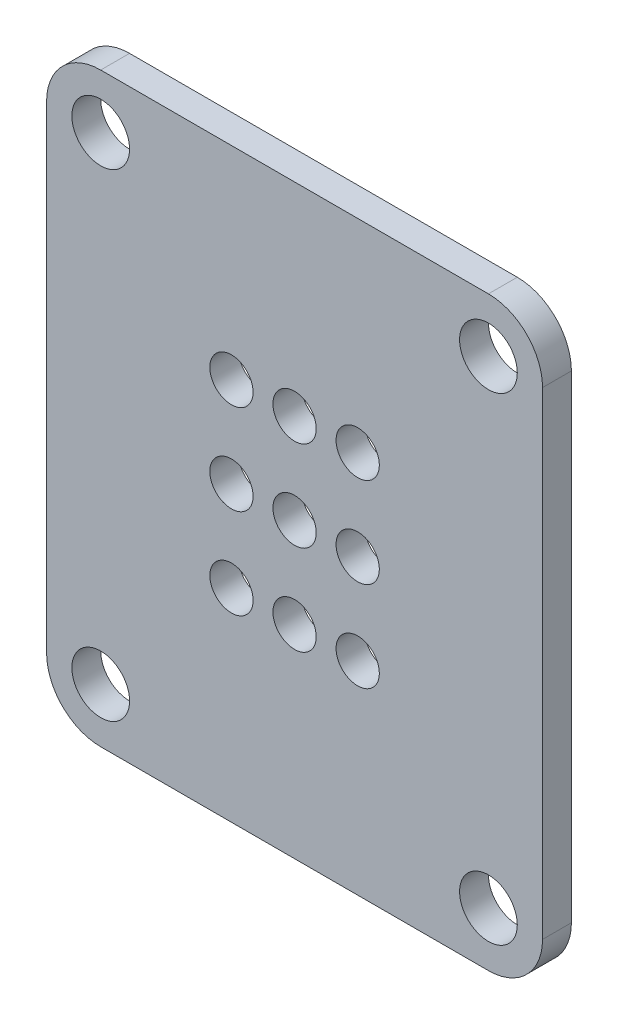
ISO-10303-21;
HEADER;
FILE_DESCRIPTION(('STEP AP214'),'2;1');
FILE_NAME('part.step','',(''),(''),'','','');
FILE_SCHEMA(('AUTOMOTIVE_DESIGN { 1 0 10303 214 1 1 1 1 }'));
ENDSEC;
DATA;
#1=APPLICATION_CONTEXT('core data for automotive mechanical design processes');
#2=APPLICATION_PROTOCOL_DEFINITION('international standard','automotive_design',2000,#1);
#3=PRODUCT_CONTEXT('',#1,'mechanical');
#4=PRODUCT('Part','Part','',(#3));
#5=PRODUCT_RELATED_PRODUCT_CATEGORY('part','',(#4));
#6=PRODUCT_DEFINITION_FORMATION('','',#4);
#7=PRODUCT_DEFINITION_CONTEXT('part definition',#1,'design');
#8=PRODUCT_DEFINITION('design','',#6,#7);
#9=PRODUCT_DEFINITION_SHAPE('','',#8);
#10=(LENGTH_UNIT() NAMED_UNIT(*) SI_UNIT(.MILLI.,.METRE.));
#11=(NAMED_UNIT(*) PLANE_ANGLE_UNIT() SI_UNIT($,.RADIAN.));
#12=(NAMED_UNIT(*) SI_UNIT($,.STERADIAN.) SOLID_ANGLE_UNIT());
#13=UNCERTAINTY_MEASURE_WITH_UNIT(LENGTH_MEASURE(1.E-05),#10,'distance_accuracy_value','');
#14=(GEOMETRIC_REPRESENTATION_CONTEXT(3) GLOBAL_UNCERTAINTY_ASSIGNED_CONTEXT((#13)) GLOBAL_UNIT_ASSIGNED_CONTEXT((#10,
#11,#12)) REPRESENTATION_CONTEXT('',''));
#15=CARTESIAN_POINT('',(0.,0.,0.));
#16=DIRECTION('',(0.,0.,1.));
#17=DIRECTION('',(1.,0.,0.));
#18=AXIS2_PLACEMENT_3D('',#15,#16,#17);
#19=CARTESIAN_POINT('',(-10.75,13.25,0.8));
#20=DIRECTION('',(0.,0.,-1.));
#21=DIRECTION('',(-1.,0.,0.));
#22=AXIS2_PLACEMENT_3D('',#19,#20,#21);
#23=CYLINDRICAL_SURFACE('',#22,3.00000000000001);
#24=CARTESIAN_POINT('',(-10.75,13.25,-0.8));
#25=DIRECTION('',(0.,0.,1.));
#26=DIRECTION('',(1.,0.,0.));
#27=AXIS2_PLACEMENT_3D('',#24,#25,#26);
#28=CIRCLE('',#27,3.00000000000001);
#29=CARTESIAN_POINT('',(-10.75,16.25,-0.8));
#30=VERTEX_POINT('',#29);
#31=CARTESIAN_POINT('',(-13.75,13.25,-0.8));
#32=VERTEX_POINT('',#31);
#33=EDGE_CURVE('E159',#30,#32,#28,.T.);
#34=ORIENTED_EDGE('',*,*,#33,.T.);
#35=DIRECTION('',(0.,0.,-1.));
#36=VECTOR('',#35,1.);
#37=CARTESIAN_POINT('',(-13.75,13.25,0.8));
#38=LINE('',#37,#36);
#39=CARTESIAN_POINT('',(-13.75,13.25,0.8));
#40=VERTEX_POINT('',#39);
#41=EDGE_CURVE('E70',#40,#32,#38,.T.);
#42=ORIENTED_EDGE('',*,*,#41,.F.);
#43=CARTESIAN_POINT('',(-10.75,13.25,0.8));
#44=DIRECTION('',(0.,0.,1.));
#45=DIRECTION('',(1.,0.,0.));
#46=AXIS2_PLACEMENT_3D('',#43,#44,#45);
#47=CIRCLE('',#46,3.00000000000001);
#48=CARTESIAN_POINT('',(-10.75,16.25,0.8));
#49=VERTEX_POINT('',#48);
#50=EDGE_CURVE('E206',#49,#40,#47,.T.);
#51=ORIENTED_EDGE('',*,*,#50,.F.);
#52=DIRECTION('',(0.,0.,-1.));
#53=VECTOR('',#52,1.);
#54=CARTESIAN_POINT('',(-10.75,16.25,0.8));
#55=LINE('',#54,#53);
#56=EDGE_CURVE('E12',#49,#30,#55,.T.);
#57=ORIENTED_EDGE('',*,*,#56,.T.);
#58=EDGE_LOOP('',(#34,#42,#51,#57));
#59=FACE_BOUND('',#58,.T.);
#60=ADVANCED_FACE('F61',(#59),#23,.T.);
#61=CARTESIAN_POINT('',(-13.75,0.,0.8));
#62=DIRECTION('',(1.,0.,0.));
#63=DIRECTION('',(0.,1.,0.));
#64=AXIS2_PLACEMENT_3D('',#61,#62,#63);
#65=PLANE('',#64);
#66=DIRECTION('',(0.,-1.,0.));
#67=VECTOR('',#66,1.);
#68=CARTESIAN_POINT('',(-13.75,0.,-0.8));
#69=LINE('',#68,#67);
#70=CARTESIAN_POINT('',(-13.75,-13.25,-0.8));
#71=VERTEX_POINT('',#70);
#72=EDGE_CURVE('E162',#32,#71,#69,.T.);
#73=ORIENTED_EDGE('',*,*,#72,.T.);
#74=DIRECTION('',(0.,0.,-1.));
#75=VECTOR('',#74,1.);
#76=CARTESIAN_POINT('',(-13.75,-13.25,0.8));
#77=LINE('',#76,#75);
#78=CARTESIAN_POINT('',(-13.75,-13.25,0.8));
#79=VERTEX_POINT('',#78);
#80=EDGE_CURVE('E180',#79,#71,#77,.T.);
#81=ORIENTED_EDGE('',*,*,#80,.F.);
#82=DIRECTION('',(0.,-1.,0.));
#83=VECTOR('',#82,1.);
#84=CARTESIAN_POINT('',(-13.75,0.,0.8));
#85=LINE('',#84,#83);
#86=EDGE_CURVE('E189',#40,#79,#85,.T.);
#87=ORIENTED_EDGE('',*,*,#86,.F.);
#88=ORIENTED_EDGE('',*,*,#41,.T.);
#89=EDGE_LOOP('',(#73,#81,#87,#88));
#90=FACE_BOUND('',#89,.T.);
#91=ADVANCED_FACE('F187',(#90),#65,.F.);
#92=CARTESIAN_POINT('',(-10.75,-13.25,0.8));
#93=DIRECTION('',(0.,0.,-1.));
#94=DIRECTION('',(-1.,0.,0.));
#95=AXIS2_PLACEMENT_3D('',#92,#93,#94);
#96=CYLINDRICAL_SURFACE('',#95,3.);
#97=CARTESIAN_POINT('',(-10.75,-13.25,-0.8));
#98=DIRECTION('',(0.,0.,1.));
#99=DIRECTION('',(1.,0.,0.));
#100=AXIS2_PLACEMENT_3D('',#97,#98,#99);
#101=CIRCLE('',#100,3.);
#102=CARTESIAN_POINT('',(-10.75,-16.25,-0.8));
#103=VERTEX_POINT('',#102);
#104=EDGE_CURVE('E164',#71,#103,#101,.T.);
#105=ORIENTED_EDGE('',*,*,#104,.T.);
#106=DIRECTION('',(0.,0.,-1.));
#107=VECTOR('',#106,1.);
#108=CARTESIAN_POINT('',(-10.75,-16.25,0.8));
#109=LINE('',#108,#107);
#110=CARTESIAN_POINT('',(-10.75,-16.25,0.8));
#111=VERTEX_POINT('',#110);
#112=EDGE_CURVE('E177',#111,#103,#109,.T.);
#113=ORIENTED_EDGE('',*,*,#112,.F.);
#114=CARTESIAN_POINT('',(-10.75,-13.25,0.8));
#115=DIRECTION('',(0.,0.,1.));
#116=DIRECTION('',(1.,0.,0.));
#117=AXIS2_PLACEMENT_3D('',#114,#115,#116);
#118=CIRCLE('',#117,3.);
#119=EDGE_CURVE('E202',#79,#111,#118,.T.);
#120=ORIENTED_EDGE('',*,*,#119,.F.);
#121=ORIENTED_EDGE('',*,*,#80,.T.);
#122=EDGE_LOOP('',(#105,#113,#120,#121));
#123=FACE_BOUND('',#122,.T.);
#124=ADVANCED_FACE('F198',(#123),#96,.T.);
#125=CARTESIAN_POINT('',(0.,-16.25,0.8));
#126=DIRECTION('',(0.,1.,0.));
#127=DIRECTION('',(0.,0.,1.));
#128=AXIS2_PLACEMENT_3D('',#125,#126,#127);
#129=PLANE('',#128);
#130=DIRECTION('',(1.,0.,0.));
#131=VECTOR('',#130,1.);
#132=CARTESIAN_POINT('',(0.,-16.25,-0.8));
#133=LINE('',#132,#131);
#134=CARTESIAN_POINT('',(10.75,-16.25,-0.8));
#135=VERTEX_POINT('',#134);
#136=EDGE_CURVE('E166',#103,#135,#133,.T.);
#137=ORIENTED_EDGE('',*,*,#136,.T.);
#138=DIRECTION('',(0.,0.,-1.));
#139=VECTOR('',#138,1.);
#140=CARTESIAN_POINT('',(10.75,-16.25,0.8));
#141=LINE('',#140,#139);
#142=CARTESIAN_POINT('',(10.75,-16.25,0.8));
#143=VERTEX_POINT('',#142);
#144=EDGE_CURVE('E149',#143,#135,#141,.T.);
#145=ORIENTED_EDGE('',*,*,#144,.F.);
#146=DIRECTION('',(1.,0.,0.));
#147=VECTOR('',#146,1.);
#148=CARTESIAN_POINT('',(0.,-16.25,0.8));
#149=LINE('',#148,#147);
#150=EDGE_CURVE('E136',#111,#143,#149,.T.);
#151=ORIENTED_EDGE('',*,*,#150,.F.);
#152=ORIENTED_EDGE('',*,*,#112,.T.);
#153=EDGE_LOOP('',(#137,#145,#151,#152));
#154=FACE_BOUND('',#153,.T.);
#155=ADVANCED_FACE('F201',(#154),#129,.F.);
#156=CARTESIAN_POINT('',(10.75,-13.25,0.8));
#157=DIRECTION('',(0.,0.,-1.));
#158=DIRECTION('',(-1.,0.,0.));
#159=AXIS2_PLACEMENT_3D('',#156,#157,#158);
#160=CYLINDRICAL_SURFACE('',#159,2.99999999999999);
#161=CARTESIAN_POINT('',(10.75,-13.25,-0.8));
#162=DIRECTION('',(0.,0.,1.));
#163=DIRECTION('',(1.,0.,0.));
#164=AXIS2_PLACEMENT_3D('',#161,#162,#163);
#165=CIRCLE('',#164,2.99999999999999);
#166=CARTESIAN_POINT('',(13.75,-13.25,-0.8));
#167=VERTEX_POINT('',#166);
#168=EDGE_CURVE('E145',#135,#167,#165,.T.);
#169=ORIENTED_EDGE('',*,*,#168,.T.);
#170=DIRECTION('',(0.,0.,-1.));
#171=VECTOR('',#170,1.);
#172=CARTESIAN_POINT('',(13.75,-13.25,0.8));
#173=LINE('',#172,#171);
#174=CARTESIAN_POINT('',(13.75,-13.25,0.8));
#175=VERTEX_POINT('',#174);
#176=EDGE_CURVE('E142',#175,#167,#173,.T.);
#177=ORIENTED_EDGE('',*,*,#176,.F.);
#178=CARTESIAN_POINT('',(10.75,-13.25,0.8));
#179=DIRECTION('',(0.,0.,1.));
#180=DIRECTION('',(1.,0.,0.));
#181=AXIS2_PLACEMENT_3D('',#178,#179,#180);
#182=CIRCLE('',#181,2.99999999999999);
#183=EDGE_CURVE('E130',#143,#175,#182,.T.);
#184=ORIENTED_EDGE('',*,*,#183,.F.);
#185=ORIENTED_EDGE('',*,*,#144,.T.);
#186=EDGE_LOOP('',(#169,#177,#184,#185));
#187=FACE_BOUND('',#186,.T.);
#188=ADVANCED_FACE('F143',(#187),#160,.T.);
#189=CARTESIAN_POINT('',(13.75,0.,0.8));
#190=DIRECTION('',(1.,0.,0.));
#191=DIRECTION('',(0.,1.,0.));
#192=AXIS2_PLACEMENT_3D('',#189,#190,#191);
#193=PLANE('',#192);
#194=DIRECTION('',(0.,-1.,0.));
#195=VECTOR('',#194,1.);
#196=CARTESIAN_POINT('',(13.75,0.,-0.8));
#197=LINE('',#196,#195);
#198=CARTESIAN_POINT('',(13.75,13.25,-0.8));
#199=VERTEX_POINT('',#198);
#200=EDGE_CURVE('E169',#199,#167,#197,.T.);
#201=ORIENTED_EDGE('',*,*,#200,.F.);
#202=DIRECTION('',(0.,0.,-1.));
#203=VECTOR('',#202,1.);
#204=CARTESIAN_POINT('',(13.75,13.25,0.8));
#205=LINE('',#204,#203);
#206=CARTESIAN_POINT('',(13.75,13.25,0.8));
#207=VERTEX_POINT('',#206);
#208=EDGE_CURVE('E105',#207,#199,#205,.T.);
#209=ORIENTED_EDGE('',*,*,#208,.F.);
#210=DIRECTION('',(0.,-1.,0.));
#211=VECTOR('',#210,1.);
#212=CARTESIAN_POINT('',(13.75,0.,0.8));
#213=LINE('',#212,#211);
#214=EDGE_CURVE('E134',#207,#175,#213,.T.);
#215=ORIENTED_EDGE('',*,*,#214,.T.);
#216=ORIENTED_EDGE('',*,*,#176,.T.);
#217=EDGE_LOOP('',(#201,#209,#215,#216));
#218=FACE_BOUND('',#217,.T.);
#219=ADVANCED_FACE('F151',(#218),#193,.T.);
#220=CARTESIAN_POINT('',(10.75,13.25,0.8));
#221=DIRECTION('',(0.,0.,-1.));
#222=DIRECTION('',(-1.,0.,0.));
#223=AXIS2_PLACEMENT_3D('',#220,#221,#222);
#224=CYLINDRICAL_SURFACE('',#223,3.);
#225=CARTESIAN_POINT('',(10.75,13.25,-0.8));
#226=DIRECTION('',(0.,0.,1.));
#227=DIRECTION('',(1.,0.,0.));
#228=AXIS2_PLACEMENT_3D('',#225,#226,#227);
#229=CIRCLE('',#228,3.);
#230=CARTESIAN_POINT('',(10.75,16.25,-0.8));
#231=VERTEX_POINT('',#230);
#232=EDGE_CURVE('E171',#199,#231,#229,.T.);
#233=ORIENTED_EDGE('',*,*,#232,.T.);
#234=DIRECTION('',(0.,0.,-1.));
#235=VECTOR('',#234,1.);
#236=CARTESIAN_POINT('',(10.75,16.25,0.8));
#237=LINE('',#236,#235);
#238=CARTESIAN_POINT('',(10.75,16.25,0.8));
#239=VERTEX_POINT('',#238);
#240=EDGE_CURVE('E112',#239,#231,#237,.T.);
#241=ORIENTED_EDGE('',*,*,#240,.F.);
#242=CARTESIAN_POINT('',(10.75,13.25,0.8));
#243=DIRECTION('',(0.,0.,1.));
#244=DIRECTION('',(1.,0.,0.));
#245=AXIS2_PLACEMENT_3D('',#242,#243,#244);
#246=CIRCLE('',#245,3.);
#247=EDGE_CURVE('E78',#207,#239,#246,.T.);
#248=ORIENTED_EDGE('',*,*,#247,.F.);
#249=ORIENTED_EDGE('',*,*,#208,.T.);
#250=EDGE_LOOP('',(#233,#241,#248,#249));
#251=FACE_BOUND('',#250,.T.);
#252=ADVANCED_FACE('F344',(#251),#224,.T.);
#253=CARTESIAN_POINT('',(0.,16.25,0.8));
#254=DIRECTION('',(0.,1.,0.));
#255=DIRECTION('',(-1.,0.,0.));
#256=AXIS2_PLACEMENT_3D('',#253,#254,#255);
#257=PLANE('',#256);
#258=DIRECTION('',(1.,0.,0.));
#259=VECTOR('',#258,1.);
#260=CARTESIAN_POINT('',(0.,16.25,-0.8));
#261=LINE('',#260,#259);
#262=EDGE_CURVE('E156',#30,#231,#261,.T.);
#263=ORIENTED_EDGE('',*,*,#262,.F.);
#264=ORIENTED_EDGE('',*,*,#56,.F.);
#265=DIRECTION('',(1.,0.,0.));
#266=VECTOR('',#265,1.);
#267=CARTESIAN_POINT('',(0.,16.25,0.8));
#268=LINE('',#267,#266);
#269=EDGE_CURVE('E173',#49,#239,#268,.T.);
#270=ORIENTED_EDGE('',*,*,#269,.T.);
#271=ORIENTED_EDGE('',*,*,#240,.T.);
#272=EDGE_LOOP('',(#263,#264,#270,#271));
#273=FACE_BOUND('',#272,.T.);
#274=ADVANCED_FACE('F63',(#273),#257,.T.);
#275=CARTESIAN_POINT('',(0.,0.,-0.8));
#276=DIRECTION('',(0.,0.,1.));
#277=DIRECTION('',(1.,0.,0.));
#278=AXIS2_PLACEMENT_3D('',#275,#276,#277);
#279=PLANE('',#278);
#280=CARTESIAN_POINT('',(0.,-5.00000000000001,-0.8));
#281=DIRECTION('',(0.,0.,1.));
#282=DIRECTION('',(1.,0.,0.));
#283=AXIS2_PLACEMENT_3D('',#280,#281,#282);
#284=CIRCLE('',#283,1.2);
#285=CARTESIAN_POINT('',(1.2,-5.00000000000001,-0.8));
#286=VERTEX_POINT('',#285);
#287=EDGE_CURVE('E236',#286,#286,#284,.T.);
#288=ORIENTED_EDGE('',*,*,#287,.T.);
#289=EDGE_LOOP('',(#288));
#290=FACE_BOUND('',#289,.T.);
#291=CARTESIAN_POINT('',(-3.5,-5.,-0.8));
#292=DIRECTION('',(0.,0.,1.));
#293=DIRECTION('',(1.,0.,0.));
#294=AXIS2_PLACEMENT_3D('',#291,#292,#293);
#295=CIRCLE('',#294,1.2);
#296=CARTESIAN_POINT('',(-2.3,-5.,-0.8));
#297=VERTEX_POINT('',#296);
#298=EDGE_CURVE('E255',#297,#297,#295,.T.);
#299=ORIENTED_EDGE('',*,*,#298,.T.);
#300=EDGE_LOOP('',(#299));
#301=FACE_BOUND('',#300,.T.);
#302=CARTESIAN_POINT('',(3.5,4.99999999999999,-0.8));
#303=DIRECTION('',(0.,0.,1.));
#304=DIRECTION('',(1.,0.,0.));
#305=AXIS2_PLACEMENT_3D('',#302,#303,#304);
#306=CIRCLE('',#305,1.2);
#307=CARTESIAN_POINT('',(4.7,4.99999999999999,-0.8));
#308=VERTEX_POINT('',#307);
#309=EDGE_CURVE('E249',#308,#308,#306,.T.);
#310=ORIENTED_EDGE('',*,*,#309,.T.);
#311=EDGE_LOOP('',(#310));
#312=FACE_BOUND('',#311,.T.);
#313=CARTESIAN_POINT('',(0.,4.99999999999999,-0.8));
#314=DIRECTION('',(0.,0.,1.));
#315=DIRECTION('',(1.,0.,0.));
#316=AXIS2_PLACEMENT_3D('',#313,#314,#315);
#317=CIRCLE('',#316,1.2);
#318=CARTESIAN_POINT('',(1.2,4.99999999999999,-0.8));
#319=VERTEX_POINT('',#318);
#320=EDGE_CURVE('E242',#319,#319,#317,.T.);
#321=ORIENTED_EDGE('',*,*,#320,.T.);
#322=EDGE_LOOP('',(#321));
#323=FACE_BOUND('',#322,.T.);
#324=CARTESIAN_POINT('',(-3.5,4.99999999999999,-0.8));
#325=DIRECTION('',(0.,0.,1.));
#326=DIRECTION('',(1.,0.,0.));
#327=AXIS2_PLACEMENT_3D('',#324,#325,#326);
#328=CIRCLE('',#327,1.2);
#329=CARTESIAN_POINT('',(-2.3,4.99999999999999,-0.8));
#330=VERTEX_POINT('',#329);
#331=EDGE_CURVE('E243',#330,#330,#328,.T.);
#332=ORIENTED_EDGE('',*,*,#331,.T.);
#333=EDGE_LOOP('',(#332));
#334=FACE_BOUND('',#333,.T.);
#335=CARTESIAN_POINT('',(-3.5,0.,-0.8));
#336=DIRECTION('',(0.,0.,1.));
#337=DIRECTION('',(1.,0.,0.));
#338=AXIS2_PLACEMENT_3D('',#335,#336,#337);
#339=CIRCLE('',#338,1.2);
#340=CARTESIAN_POINT('',(-2.3,0.,-0.8));
#341=VERTEX_POINT('',#340);
#342=EDGE_CURVE('E278',#341,#341,#339,.T.);
#343=ORIENTED_EDGE('',*,*,#342,.T.);
#344=EDGE_LOOP('',(#343));
#345=FACE_BOUND('',#344,.T.);
#346=CARTESIAN_POINT('',(0.,0.,-0.8));
#347=DIRECTION('',(0.,0.,1.));
#348=DIRECTION('',(1.,0.,0.));
#349=AXIS2_PLACEMENT_3D('',#346,#347,#348);
#350=CIRCLE('',#349,1.2);
#351=CARTESIAN_POINT('',(1.2,0.,-0.8));
#352=VERTEX_POINT('',#351);
#353=EDGE_CURVE('E272',#352,#352,#350,.T.);
#354=ORIENTED_EDGE('',*,*,#353,.T.);
#355=EDGE_LOOP('',(#354));
#356=FACE_BOUND('',#355,.T.);
#357=CARTESIAN_POINT('',(3.5,0.,-0.8));
#358=DIRECTION('',(0.,0.,1.));
#359=DIRECTION('',(1.,0.,0.));
#360=AXIS2_PLACEMENT_3D('',#357,#358,#359);
#361=CIRCLE('',#360,1.2);
#362=CARTESIAN_POINT('',(4.7,0.,-0.8));
#363=VERTEX_POINT('',#362);
#364=EDGE_CURVE('E266',#363,#363,#361,.T.);
#365=ORIENTED_EDGE('',*,*,#364,.T.);
#366=EDGE_LOOP('',(#365));
#367=FACE_BOUND('',#366,.T.);
#368=CARTESIAN_POINT('',(3.5,-5.00000000000001,-0.8));
#369=DIRECTION('',(0.,0.,1.));
#370=DIRECTION('',(1.,0.,0.));
#371=AXIS2_PLACEMENT_3D('',#368,#369,#370);
#372=CIRCLE('',#371,1.2);
#373=CARTESIAN_POINT('',(4.7,-5.00000000000001,-0.8));
#374=VERTEX_POINT('',#373);
#375=EDGE_CURVE('E219',#374,#374,#372,.T.);
#376=ORIENTED_EDGE('',*,*,#375,.T.);
#377=EDGE_LOOP('',(#376));
#378=FACE_BOUND('',#377,.T.);
#379=CARTESIAN_POINT('',(-10.75,13.25,-0.8));
#380=DIRECTION('',(0.,0.,1.));
#381=DIRECTION('',(1.,0.,0.));
#382=AXIS2_PLACEMENT_3D('',#379,#380,#381);
#383=CIRCLE('',#382,1.6);
#384=CARTESIAN_POINT('',(-9.15,13.25,-0.8));
#385=VERTEX_POINT('',#384);
#386=EDGE_CURVE('E218',#385,#385,#383,.T.);
#387=ORIENTED_EDGE('',*,*,#386,.T.);
#388=EDGE_LOOP('',(#387));
#389=FACE_BOUND('',#388,.T.);
#390=CARTESIAN_POINT('',(-10.75,-13.25,-0.8));
#391=DIRECTION('',(0.,0.,1.));
#392=DIRECTION('',(1.,0.,0.));
#393=AXIS2_PLACEMENT_3D('',#390,#391,#392);
#394=CIRCLE('',#393,1.6);
#395=CARTESIAN_POINT('',(-9.14999999999999,-13.25,-0.8));
#396=VERTEX_POINT('',#395);
#397=EDGE_CURVE('E225',#396,#396,#394,.T.);
#398=ORIENTED_EDGE('',*,*,#397,.T.);
#399=EDGE_LOOP('',(#398));
#400=FACE_BOUND('',#399,.T.);
#401=CARTESIAN_POINT('',(10.75,-13.25,-0.8));
#402=DIRECTION('',(0.,0.,1.));
#403=DIRECTION('',(1.,0.,0.));
#404=AXIS2_PLACEMENT_3D('',#401,#402,#403);
#405=CIRCLE('',#404,1.6);
#406=CARTESIAN_POINT('',(12.35,-13.25,-0.8));
#407=VERTEX_POINT('',#406);
#408=EDGE_CURVE('E212',#407,#407,#405,.T.);
#409=ORIENTED_EDGE('',*,*,#408,.T.);
#410=EDGE_LOOP('',(#409));
#411=FACE_BOUND('',#410,.T.);
#412=CARTESIAN_POINT('',(10.75,13.25,-0.8));
#413=DIRECTION('',(0.,0.,1.));
#414=DIRECTION('',(1.,0.,0.));
#415=AXIS2_PLACEMENT_3D('',#412,#413,#414);
#416=CIRCLE('',#415,1.6);
#417=CARTESIAN_POINT('',(12.35,13.25,-0.8));
#418=VERTEX_POINT('',#417);
#419=EDGE_CURVE('E160',#418,#418,#416,.T.);
#420=ORIENTED_EDGE('',*,*,#419,.T.);
#421=EDGE_LOOP('',(#420));
#422=FACE_BOUND('',#421,.T.);
#423=ORIENTED_EDGE('',*,*,#262,.T.);
#424=ORIENTED_EDGE('',*,*,#232,.F.);
#425=ORIENTED_EDGE('',*,*,#200,.T.);
#426=ORIENTED_EDGE('',*,*,#168,.F.);
#427=ORIENTED_EDGE('',*,*,#136,.F.);
#428=ORIENTED_EDGE('',*,*,#104,.F.);
#429=ORIENTED_EDGE('',*,*,#72,.F.);
#430=ORIENTED_EDGE('',*,*,#33,.F.);
#431=EDGE_LOOP('',(#423,#424,#425,#426,#427,#428,#429,#430));
#432=FACE_BOUND('',#431,.T.);
#433=ADVANCED_FACE('F194',(#290,#301,#312,#323,#334,#345,#356,#367,#378,#389,#400,#411,#422,
#432),#279,.F.);
#434=CARTESIAN_POINT('',(0.,0.,0.8));
#435=DIRECTION('',(0.,0.,1.));
#436=DIRECTION('',(1.,0.,0.));
#437=AXIS2_PLACEMENT_3D('',#434,#435,#436);
#438=PLANE('',#437);
#439=CARTESIAN_POINT('',(0.,-5.00000000000001,0.8));
#440=DIRECTION('',(0.,0.,1.));
#441=DIRECTION('',(1.,0.,0.));
#442=AXIS2_PLACEMENT_3D('',#439,#440,#441);
#443=CIRCLE('',#442,1.2);
#444=CARTESIAN_POINT('',(1.2,-5.00000000000001,0.8));
#445=VERTEX_POINT('',#444);
#446=EDGE_CURVE('E258',#445,#445,#443,.T.);
#447=ORIENTED_EDGE('',*,*,#446,.F.);
#448=EDGE_LOOP('',(#447));
#449=FACE_BOUND('',#448,.T.);
#450=CARTESIAN_POINT('',(-3.5,-5.,0.8));
#451=DIRECTION('',(0.,0.,1.));
#452=DIRECTION('',(1.,0.,0.));
#453=AXIS2_PLACEMENT_3D('',#450,#451,#452);
#454=CIRCLE('',#453,1.2);
#455=CARTESIAN_POINT('',(-2.3,-5.,0.8));
#456=VERTEX_POINT('',#455);
#457=EDGE_CURVE('E252',#456,#456,#454,.T.);
#458=ORIENTED_EDGE('',*,*,#457,.F.);
#459=EDGE_LOOP('',(#458));
#460=FACE_BOUND('',#459,.T.);
#461=CARTESIAN_POINT('',(3.5,4.99999999999999,0.8));
#462=DIRECTION('',(0.,0.,1.));
#463=DIRECTION('',(1.,0.,0.));
#464=AXIS2_PLACEMENT_3D('',#461,#462,#463);
#465=CIRCLE('',#464,1.2);
#466=CARTESIAN_POINT('',(4.7,4.99999999999999,0.8));
#467=VERTEX_POINT('',#466);
#468=EDGE_CURVE('E246',#467,#467,#465,.T.);
#469=ORIENTED_EDGE('',*,*,#468,.F.);
#470=EDGE_LOOP('',(#469));
#471=FACE_BOUND('',#470,.T.);
#472=CARTESIAN_POINT('',(0.,4.99999999999999,0.8));
#473=DIRECTION('',(0.,0.,1.));
#474=DIRECTION('',(1.,0.,0.));
#475=AXIS2_PLACEMENT_3D('',#472,#473,#474);
#476=CIRCLE('',#475,1.2);
#477=CARTESIAN_POINT('',(1.2,4.99999999999999,0.8));
#478=VERTEX_POINT('',#477);
#479=EDGE_CURVE('E239',#478,#478,#476,.T.);
#480=ORIENTED_EDGE('',*,*,#479,.F.);
#481=EDGE_LOOP('',(#480));
#482=FACE_BOUND('',#481,.T.);
#483=CARTESIAN_POINT('',(-3.5,4.99999999999999,0.8));
#484=DIRECTION('',(0.,0.,1.));
#485=DIRECTION('',(1.,0.,0.));
#486=AXIS2_PLACEMENT_3D('',#483,#484,#485);
#487=CIRCLE('',#486,1.2);
#488=CARTESIAN_POINT('',(-2.3,4.99999999999999,0.8));
#489=VERTEX_POINT('',#488);
#490=EDGE_CURVE('E281',#489,#489,#487,.T.);
#491=ORIENTED_EDGE('',*,*,#490,.F.);
#492=EDGE_LOOP('',(#491));
#493=FACE_BOUND('',#492,.T.);
#494=CARTESIAN_POINT('',(-3.5,0.,0.8));
#495=DIRECTION('',(0.,0.,1.));
#496=DIRECTION('',(1.,0.,0.));
#497=AXIS2_PLACEMENT_3D('',#494,#495,#496);
#498=CIRCLE('',#497,1.2);
#499=CARTESIAN_POINT('',(-2.3,0.,0.8));
#500=VERTEX_POINT('',#499);
#501=EDGE_CURVE('E275',#500,#500,#498,.T.);
#502=ORIENTED_EDGE('',*,*,#501,.F.);
#503=EDGE_LOOP('',(#502));
#504=FACE_BOUND('',#503,.T.);
#505=CARTESIAN_POINT('',(0.,0.,0.8));
#506=DIRECTION('',(0.,0.,1.));
#507=DIRECTION('',(1.,0.,0.));
#508=AXIS2_PLACEMENT_3D('',#505,#506,#507);
#509=CIRCLE('',#508,1.2);
#510=CARTESIAN_POINT('',(1.2,0.,0.8));
#511=VERTEX_POINT('',#510);
#512=EDGE_CURVE('E269',#511,#511,#509,.T.);
#513=ORIENTED_EDGE('',*,*,#512,.F.);
#514=EDGE_LOOP('',(#513));
#515=FACE_BOUND('',#514,.T.);
#516=CARTESIAN_POINT('',(3.5,0.,0.8));
#517=DIRECTION('',(0.,0.,1.));
#518=DIRECTION('',(1.,0.,0.));
#519=AXIS2_PLACEMENT_3D('',#516,#517,#518);
#520=CIRCLE('',#519,1.2);
#521=CARTESIAN_POINT('',(4.7,0.,0.8));
#522=VERTEX_POINT('',#521);
#523=EDGE_CURVE('E263',#522,#522,#520,.T.);
#524=ORIENTED_EDGE('',*,*,#523,.F.);
#525=EDGE_LOOP('',(#524));
#526=FACE_BOUND('',#525,.T.);
#527=CARTESIAN_POINT('',(3.5,-5.00000000000001,0.8));
#528=DIRECTION('',(0.,0.,1.));
#529=DIRECTION('',(1.,0.,0.));
#530=AXIS2_PLACEMENT_3D('',#527,#528,#529);
#531=CIRCLE('',#530,1.2);
#532=CARTESIAN_POINT('',(4.7,-5.00000000000001,0.8));
#533=VERTEX_POINT('',#532);
#534=EDGE_CURVE('E233',#533,#533,#531,.T.);
#535=ORIENTED_EDGE('',*,*,#534,.F.);
#536=EDGE_LOOP('',(#535));
#537=FACE_BOUND('',#536,.T.);
#538=CARTESIAN_POINT('',(-10.75,13.25,0.8));
#539=DIRECTION('',(0.,0.,1.));
#540=DIRECTION('',(1.,0.,0.));
#541=AXIS2_PLACEMENT_3D('',#538,#539,#540);
#542=CIRCLE('',#541,1.6);
#543=CARTESIAN_POINT('',(-9.15,13.25,0.8));
#544=VERTEX_POINT('',#543);
#545=EDGE_CURVE('E215',#544,#544,#542,.T.);
#546=ORIENTED_EDGE('',*,*,#545,.F.);
#547=EDGE_LOOP('',(#546));
#548=FACE_BOUND('',#547,.T.);
#549=CARTESIAN_POINT('',(-10.75,-13.25,0.8));
#550=DIRECTION('',(0.,0.,1.));
#551=DIRECTION('',(1.,0.,0.));
#552=AXIS2_PLACEMENT_3D('',#549,#550,#551);
#553=CIRCLE('',#552,1.6);
#554=CARTESIAN_POINT('',(-9.14999999999999,-13.25,0.8));
#555=VERTEX_POINT('',#554);
#556=EDGE_CURVE('E222',#555,#555,#553,.T.);
#557=ORIENTED_EDGE('',*,*,#556,.F.);
#558=EDGE_LOOP('',(#557));
#559=FACE_BOUND('',#558,.T.);
#560=CARTESIAN_POINT('',(10.75,-13.25,0.8));
#561=DIRECTION('',(0.,0.,1.));
#562=DIRECTION('',(1.,0.,0.));
#563=AXIS2_PLACEMENT_3D('',#560,#561,#562);
#564=CIRCLE('',#563,1.6);
#565=CARTESIAN_POINT('',(12.35,-13.25,0.8));
#566=VERTEX_POINT('',#565);
#567=EDGE_CURVE('E228',#566,#566,#564,.T.);
#568=ORIENTED_EDGE('',*,*,#567,.F.);
#569=EDGE_LOOP('',(#568));
#570=FACE_BOUND('',#569,.T.);
#571=CARTESIAN_POINT('',(10.75,13.25,0.8));
#572=DIRECTION('',(0.,0.,1.));
#573=DIRECTION('',(1.,0.,0.));
#574=AXIS2_PLACEMENT_3D('',#571,#572,#573);
#575=CIRCLE('',#574,1.6);
#576=CARTESIAN_POINT('',(12.35,13.25,0.8));
#577=VERTEX_POINT('',#576);
#578=EDGE_CURVE('E209',#577,#577,#575,.T.);
#579=ORIENTED_EDGE('',*,*,#578,.F.);
#580=EDGE_LOOP('',(#579));
#581=FACE_BOUND('',#580,.T.);
#582=ORIENTED_EDGE('',*,*,#269,.F.);
#583=ORIENTED_EDGE('',*,*,#50,.T.);
#584=ORIENTED_EDGE('',*,*,#86,.T.);
#585=ORIENTED_EDGE('',*,*,#119,.T.);
#586=ORIENTED_EDGE('',*,*,#150,.T.);
#587=ORIENTED_EDGE('',*,*,#183,.T.);
#588=ORIENTED_EDGE('',*,*,#214,.F.);
#589=ORIENTED_EDGE('',*,*,#247,.T.);
#590=EDGE_LOOP('',(#582,#583,#584,#585,#586,#587,#588,#589));
#591=FACE_BOUND('',#590,.T.);
#592=ADVANCED_FACE('F132',(#449,#460,#471,#482,#493,#504,#515,#526,#537,#548,#559,#570,#581,
#591),#438,.T.);
#593=CARTESIAN_POINT('',(10.75,13.25,-0.8));
#594=DIRECTION('',(0.,0.,1.));
#595=DIRECTION('',(1.,0.,0.));
#596=AXIS2_PLACEMENT_3D('',#593,#594,#595);
#597=CYLINDRICAL_SURFACE('',#596,1.6);
#598=ORIENTED_EDGE('',*,*,#419,.F.);
#599=EDGE_LOOP('',(#598));
#600=FACE_BOUND('',#599,.T.);
#601=ORIENTED_EDGE('',*,*,#578,.T.);
#602=EDGE_LOOP('',(#601));
#603=FACE_BOUND('',#602,.T.);
#604=ADVANCED_FACE('F299',(#600,#603),#597,.F.);
#605=CARTESIAN_POINT('',(10.75,-13.25,-0.8));
#606=DIRECTION('',(0.,0.,1.));
#607=DIRECTION('',(1.,0.,0.));
#608=AXIS2_PLACEMENT_3D('',#605,#606,#607);
#609=CYLINDRICAL_SURFACE('',#608,1.6);
#610=ORIENTED_EDGE('',*,*,#408,.F.);
#611=EDGE_LOOP('',(#610));
#612=FACE_BOUND('',#611,.T.);
#613=ORIENTED_EDGE('',*,*,#567,.T.);
#614=EDGE_LOOP('',(#613));
#615=FACE_BOUND('',#614,.T.);
#616=ADVANCED_FACE('F319',(#612,#615),#609,.F.);
#617=CARTESIAN_POINT('',(-10.75,-13.25,-0.8));
#618=DIRECTION('',(0.,0.,1.));
#619=DIRECTION('',(1.,0.,0.));
#620=AXIS2_PLACEMENT_3D('',#617,#618,#619);
#621=CYLINDRICAL_SURFACE('',#620,1.6);
#622=ORIENTED_EDGE('',*,*,#397,.F.);
#623=EDGE_LOOP('',(#622));
#624=FACE_BOUND('',#623,.T.);
#625=ORIENTED_EDGE('',*,*,#556,.T.);
#626=EDGE_LOOP('',(#625));
#627=FACE_BOUND('',#626,.T.);
#628=ADVANCED_FACE('F325',(#624,#627),#621,.F.);
#629=CARTESIAN_POINT('',(-10.75,13.25,-0.8));
#630=DIRECTION('',(0.,0.,1.));
#631=DIRECTION('',(1.,0.,0.));
#632=AXIS2_PLACEMENT_3D('',#629,#630,#631);
#633=CYLINDRICAL_SURFACE('',#632,1.6);
#634=ORIENTED_EDGE('',*,*,#386,.F.);
#635=EDGE_LOOP('',(#634));
#636=FACE_BOUND('',#635,.T.);
#637=ORIENTED_EDGE('',*,*,#545,.T.);
#638=EDGE_LOOP('',(#637));
#639=FACE_BOUND('',#638,.T.);
#640=ADVANCED_FACE('F377',(#636,#639),#633,.F.);
#641=CARTESIAN_POINT('',(3.5,-5.00000000000001,-0.8));
#642=DIRECTION('',(0.,0.,1.));
#643=DIRECTION('',(1.,0.,0.));
#644=AXIS2_PLACEMENT_3D('',#641,#642,#643);
#645=CYLINDRICAL_SURFACE('',#644,1.2);
#646=ORIENTED_EDGE('',*,*,#375,.F.);
#647=EDGE_LOOP('',(#646));
#648=FACE_BOUND('',#647,.T.);
#649=ORIENTED_EDGE('',*,*,#534,.T.);
#650=EDGE_LOOP('',(#649));
#651=FACE_BOUND('',#650,.T.);
#652=ADVANCED_FACE('F374',(#648,#651),#645,.F.);
#653=CARTESIAN_POINT('',(3.5,0.,-0.8));
#654=DIRECTION('',(0.,0.,1.));
#655=DIRECTION('',(1.,0.,0.));
#656=AXIS2_PLACEMENT_3D('',#653,#654,#655);
#657=CYLINDRICAL_SURFACE('',#656,1.2);
#658=ORIENTED_EDGE('',*,*,#364,.F.);
#659=EDGE_LOOP('',(#658));
#660=FACE_BOUND('',#659,.T.);
#661=ORIENTED_EDGE('',*,*,#523,.T.);
#662=EDGE_LOOP('',(#661));
#663=FACE_BOUND('',#662,.T.);
#664=ADVANCED_FACE('F376',(#660,#663),#657,.F.);
#665=CARTESIAN_POINT('',(0.,0.,-0.8));
#666=DIRECTION('',(0.,0.,1.));
#667=DIRECTION('',(1.,0.,0.));
#668=AXIS2_PLACEMENT_3D('',#665,#666,#667);
#669=CYLINDRICAL_SURFACE('',#668,1.2);
#670=ORIENTED_EDGE('',*,*,#353,.F.);
#671=EDGE_LOOP('',(#670));
#672=FACE_BOUND('',#671,.T.);
#673=ORIENTED_EDGE('',*,*,#512,.T.);
#674=EDGE_LOOP('',(#673));
#675=FACE_BOUND('',#674,.T.);
#676=ADVANCED_FACE('F409',(#672,#675),#669,.F.);
#677=CARTESIAN_POINT('',(-3.5,0.,-0.8));
#678=DIRECTION('',(0.,0.,1.));
#679=DIRECTION('',(1.,0.,0.));
#680=AXIS2_PLACEMENT_3D('',#677,#678,#679);
#681=CYLINDRICAL_SURFACE('',#680,1.2);
#682=ORIENTED_EDGE('',*,*,#342,.F.);
#683=EDGE_LOOP('',(#682));
#684=FACE_BOUND('',#683,.T.);
#685=ORIENTED_EDGE('',*,*,#501,.T.);
#686=EDGE_LOOP('',(#685));
#687=FACE_BOUND('',#686,.T.);
#688=ADVANCED_FACE('F293',(#684,#687),#681,.F.);
#689=CARTESIAN_POINT('',(-3.5,4.99999999999999,-0.8));
#690=DIRECTION('',(0.,0.,1.));
#691=DIRECTION('',(1.,0.,0.));
#692=AXIS2_PLACEMENT_3D('',#689,#690,#691);
#693=CYLINDRICAL_SURFACE('',#692,1.2);
#694=ORIENTED_EDGE('',*,*,#331,.F.);
#695=EDGE_LOOP('',(#694));
#696=FACE_BOUND('',#695,.T.);
#697=ORIENTED_EDGE('',*,*,#490,.T.);
#698=EDGE_LOOP('',(#697));
#699=FACE_BOUND('',#698,.T.);
#700=ADVANCED_FACE('F289',(#696,#699),#693,.F.);
#701=CARTESIAN_POINT('',(0.,4.99999999999999,-0.8));
#702=DIRECTION('',(0.,0.,1.));
#703=DIRECTION('',(1.,0.,0.));
#704=AXIS2_PLACEMENT_3D('',#701,#702,#703);
#705=CYLINDRICAL_SURFACE('',#704,1.2);
#706=ORIENTED_EDGE('',*,*,#320,.F.);
#707=EDGE_LOOP('',(#706));
#708=FACE_BOUND('',#707,.T.);
#709=ORIENTED_EDGE('',*,*,#479,.T.);
#710=EDGE_LOOP('',(#709));
#711=FACE_BOUND('',#710,.T.);
#712=ADVANCED_FACE('F292',(#708,#711),#705,.F.);
#713=CARTESIAN_POINT('',(3.5,4.99999999999999,-0.8));
#714=DIRECTION('',(0.,0.,1.));
#715=DIRECTION('',(1.,0.,0.));
#716=AXIS2_PLACEMENT_3D('',#713,#714,#715);
#717=CYLINDRICAL_SURFACE('',#716,1.2);
#718=ORIENTED_EDGE('',*,*,#309,.F.);
#719=EDGE_LOOP('',(#718));
#720=FACE_BOUND('',#719,.T.);
#721=ORIENTED_EDGE('',*,*,#468,.T.);
#722=EDGE_LOOP('',(#721));
#723=FACE_BOUND('',#722,.T.);
#724=ADVANCED_FACE('F362',(#720,#723),#717,.F.);
#725=CARTESIAN_POINT('',(-3.5,-5.,-0.8));
#726=DIRECTION('',(0.,0.,1.));
#727=DIRECTION('',(1.,0.,0.));
#728=AXIS2_PLACEMENT_3D('',#725,#726,#727);
#729=CYLINDRICAL_SURFACE('',#728,1.2);
#730=ORIENTED_EDGE('',*,*,#298,.F.);
#731=EDGE_LOOP('',(#730));
#732=FACE_BOUND('',#731,.T.);
#733=ORIENTED_EDGE('',*,*,#457,.T.);
#734=EDGE_LOOP('',(#733));
#735=FACE_BOUND('',#734,.T.);
#736=ADVANCED_FACE('F369',(#732,#735),#729,.F.);
#737=CARTESIAN_POINT('',(0.,-5.00000000000001,-0.8));
#738=DIRECTION('',(0.,0.,1.));
#739=DIRECTION('',(1.,0.,0.));
#740=AXIS2_PLACEMENT_3D('',#737,#738,#739);
#741=CYLINDRICAL_SURFACE('',#740,1.2);
#742=ORIENTED_EDGE('',*,*,#287,.F.);
#743=EDGE_LOOP('',(#742));
#744=FACE_BOUND('',#743,.T.);
#745=ORIENTED_EDGE('',*,*,#446,.T.);
#746=EDGE_LOOP('',(#745));
#747=FACE_BOUND('',#746,.T.);
#748=ADVANCED_FACE('F448',(#744,#747),#741,.F.);
#749=CLOSED_SHELL('',(#60,#91,#124,#155,#188,#219,#252,#274,#433,#592,#604,#616,#628,#640,#652,
#664,#676,#688,#700,#712,#724,#736,#748));
#750=MANIFOLD_SOLID_BREP('B2',#749);
#751=ADVANCED_BREP_SHAPE_REPRESENTATION('',(#18,#750),#14);
#752=SHAPE_DEFINITION_REPRESENTATION(#9,#751);
ENDSEC;
END-ISO-10303-21;
